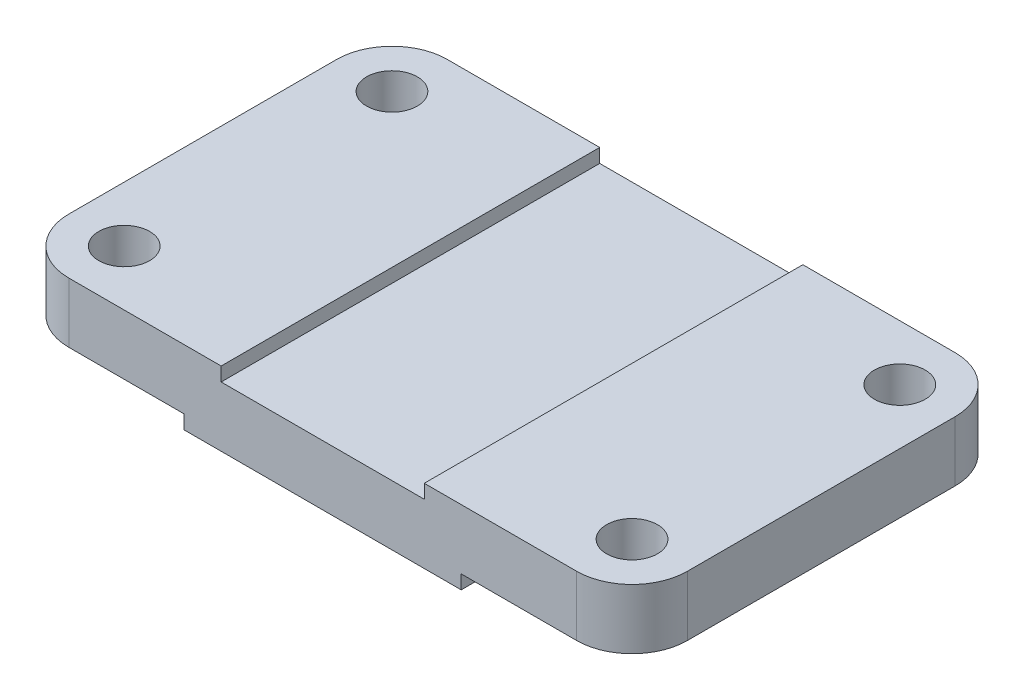
ISO-10303-21;
HEADER;
FILE_DESCRIPTION(('STEP AP214'),'2;1');
FILE_NAME('part.step','',(''),(''),'','','');
FILE_SCHEMA(('AUTOMOTIVE_DESIGN { 1 0 10303 214 1 1 1 1 }'));
ENDSEC;
DATA;
#1=APPLICATION_CONTEXT('core data for automotive mechanical design processes');
#2=APPLICATION_PROTOCOL_DEFINITION('international standard','automotive_design',2000,#1);
#3=PRODUCT_CONTEXT('',#1,'mechanical');
#4=PRODUCT('Part','Part','',(#3));
#5=PRODUCT_RELATED_PRODUCT_CATEGORY('part','',(#4));
#6=PRODUCT_DEFINITION_FORMATION('','',#4);
#7=PRODUCT_DEFINITION_CONTEXT('part definition',#1,'design');
#8=PRODUCT_DEFINITION('design','',#6,#7);
#9=PRODUCT_DEFINITION_SHAPE('','',#8);
#10=(LENGTH_UNIT() NAMED_UNIT(*) SI_UNIT(.MILLI.,.METRE.));
#11=(NAMED_UNIT(*) PLANE_ANGLE_UNIT() SI_UNIT($,.RADIAN.));
#12=(NAMED_UNIT(*) SI_UNIT($,.STERADIAN.) SOLID_ANGLE_UNIT());
#13=UNCERTAINTY_MEASURE_WITH_UNIT(LENGTH_MEASURE(1.E-05),#10,'distance_accuracy_value','');
#14=(GEOMETRIC_REPRESENTATION_CONTEXT(3) GLOBAL_UNCERTAINTY_ASSIGNED_CONTEXT((#13)) GLOBAL_UNIT_ASSIGNED_CONTEXT((#10,
#11,#12)) REPRESENTATION_CONTEXT('',''));
#15=CARTESIAN_POINT('',(0.,0.,0.));
#16=DIRECTION('',(0.,0.,1.));
#17=DIRECTION('',(1.,0.,0.));
#18=AXIS2_PLACEMENT_3D('',#15,#16,#17);
#19=CARTESIAN_POINT('',(-67.,16.,41.));
#20=DIRECTION('',(1.,0.,0.));
#21=DIRECTION('',(0.,0.,-1.));
#22=AXIS2_PLACEMENT_3D('',#19,#20,#21);
#23=PLANE('',#22);
#24=DIRECTION('',(0.,0.,-1.));
#25=VECTOR('',#24,1.);
#26=CARTESIAN_POINT('',(-67.,16.,41.));
#27=LINE('',#26,#25);
#28=CARTESIAN_POINT('',(-67.,16.,29.));
#29=VERTEX_POINT('',#28);
#30=CARTESIAN_POINT('',(-67.,16.,-29.));
#31=VERTEX_POINT('',#30);
#32=EDGE_CURVE('E192',#29,#31,#27,.T.);
#33=ORIENTED_EDGE('',*,*,#32,.T.);
#34=DIRECTION('',(0.,-1.,0.));
#35=VECTOR('',#34,1.);
#36=CARTESIAN_POINT('',(-67.,16.,-29.));
#37=LINE('',#36,#35);
#38=CARTESIAN_POINT('',(-67.,3.,-29.));
#39=VERTEX_POINT('',#38);
#40=EDGE_CURVE('E244',#31,#39,#37,.T.);
#41=ORIENTED_EDGE('',*,*,#40,.T.);
#42=DIRECTION('',(0.,0.,-1.));
#43=VECTOR('',#42,1.);
#44=CARTESIAN_POINT('',(-67.,3.,41.));
#45=LINE('',#44,#43);
#46=CARTESIAN_POINT('',(-67.,3.,29.));
#47=VERTEX_POINT('',#46);
#48=EDGE_CURVE('E167',#47,#39,#45,.T.);
#49=ORIENTED_EDGE('',*,*,#48,.F.);
#50=DIRECTION('',(0.,-1.,0.));
#51=VECTOR('',#50,1.);
#52=CARTESIAN_POINT('',(-67.,16.,29.));
#53=LINE('',#52,#51);
#54=EDGE_CURVE('E242',#47,#29,#53,.F.);
#55=ORIENTED_EDGE('',*,*,#54,.T.);
#56=EDGE_LOOP('',(#33,#41,#49,#55));
#57=FACE_BOUND('',#56,.T.);
#58=ADVANCED_FACE('F32',(#57),#23,.F.);
#59=CARTESIAN_POINT('',(-67.,3.,41.));
#60=DIRECTION('',(0.,1.,0.));
#61=DIRECTION('',(0.,0.,1.));
#62=AXIS2_PLACEMENT_3D('',#59,#60,#61);
#63=PLANE('',#62);
#64=CARTESIAN_POINT('',(-55.,3.,29.));
#65=DIRECTION('',(0.,1.,0.));
#66=DIRECTION('',(0.,0.,1.));
#67=AXIS2_PLACEMENT_3D('',#64,#65,#66);
#68=CIRCLE('',#67,5.5);
#69=CARTESIAN_POINT('',(-55.,3.,34.5));
#70=VERTEX_POINT('',#69);
#71=EDGE_CURVE('E517',#70,#70,#68,.T.);
#72=ORIENTED_EDGE('',*,*,#71,.T.);
#73=EDGE_LOOP('',(#72));
#74=FACE_BOUND('',#73,.T.);
#75=CARTESIAN_POINT('',(-55.,3.,-29.));
#76=DIRECTION('',(0.,1.,0.));
#77=DIRECTION('',(0.,0.,1.));
#78=AXIS2_PLACEMENT_3D('',#75,#76,#77);
#79=CIRCLE('',#78,5.5);
#80=CARTESIAN_POINT('',(-55.,3.,-23.5));
#81=VERTEX_POINT('',#80);
#82=EDGE_CURVE('E36',#81,#81,#79,.T.);
#83=ORIENTED_EDGE('',*,*,#82,.T.);
#84=EDGE_LOOP('',(#83));
#85=FACE_BOUND('',#84,.T.);
#86=ORIENTED_EDGE('',*,*,#48,.T.);
#87=CARTESIAN_POINT('',(-55.,3.,-29.));
#88=DIRECTION('',(0.,1.,0.));
#89=DIRECTION('',(0.,0.,1.));
#90=AXIS2_PLACEMENT_3D('',#87,#88,#89);
#91=CIRCLE('',#90,12.);
#92=CARTESIAN_POINT('',(-55.,3.,-41.));
#93=VERTEX_POINT('',#92);
#94=EDGE_CURVE('E249',#39,#93,#91,.F.);
#95=ORIENTED_EDGE('',*,*,#94,.T.);
#96=DIRECTION('',(1.,0.,0.));
#97=VECTOR('',#96,1.);
#98=CARTESIAN_POINT('',(-67.,3.,-41.));
#99=LINE('',#98,#97);
#100=CARTESIAN_POINT('',(-30.,3.,-41.));
#101=VERTEX_POINT('',#100);
#102=EDGE_CURVE('E164',#93,#101,#99,.T.);
#103=ORIENTED_EDGE('',*,*,#102,.T.);
#104=DIRECTION('',(0.,0.,-1.));
#105=VECTOR('',#104,1.);
#106=CARTESIAN_POINT('',(-30.,3.,41.));
#107=LINE('',#106,#105);
#108=CARTESIAN_POINT('',(-30.,3.,41.));
#109=VERTEX_POINT('',#108);
#110=EDGE_CURVE('E160',#109,#101,#107,.T.);
#111=ORIENTED_EDGE('',*,*,#110,.F.);
#112=DIRECTION('',(1.,0.,0.));
#113=VECTOR('',#112,1.);
#114=CARTESIAN_POINT('',(-67.,3.,41.));
#115=LINE('',#114,#113);
#116=CARTESIAN_POINT('',(-55.,3.,41.));
#117=VERTEX_POINT('',#116);
#118=EDGE_CURVE('E148',#117,#109,#115,.T.);
#119=ORIENTED_EDGE('',*,*,#118,.F.);
#120=CARTESIAN_POINT('',(-55.,3.,29.));
#121=DIRECTION('',(0.,1.,0.));
#122=DIRECTION('',(0.,0.,1.));
#123=AXIS2_PLACEMENT_3D('',#120,#121,#122);
#124=CIRCLE('',#123,12.);
#125=EDGE_CURVE('E247',#117,#47,#124,.F.);
#126=ORIENTED_EDGE('',*,*,#125,.T.);
#127=EDGE_LOOP('',(#86,#95,#103,#111,#119,#126));
#128=FACE_BOUND('',#127,.T.);
#129=ADVANCED_FACE('F162',(#74,#85,#128),#63,.F.);
#130=CARTESIAN_POINT('',(-30.,0.,41.));
#131=DIRECTION('',(1.,0.,0.));
#132=DIRECTION('',(0.,0.,-1.));
#133=AXIS2_PLACEMENT_3D('',#130,#131,#132);
#134=PLANE('',#133);
#135=DIRECTION('',(0.,-1.,0.));
#136=VECTOR('',#135,1.);
#137=CARTESIAN_POINT('',(-30.,0.,-41.));
#138=LINE('',#137,#136);
#139=CARTESIAN_POINT('',(-30.,0.,-41.));
#140=VERTEX_POINT('',#139);
#141=EDGE_CURVE('E194',#101,#140,#138,.T.);
#142=ORIENTED_EDGE('',*,*,#141,.T.);
#143=DIRECTION('',(0.,0.,-1.));
#144=VECTOR('',#143,1.);
#145=CARTESIAN_POINT('',(-30.,0.,41.));
#146=LINE('',#145,#144);
#147=CARTESIAN_POINT('',(-30.,0.,41.));
#148=VERTEX_POINT('',#147);
#149=EDGE_CURVE('E168',#148,#140,#146,.T.);
#150=ORIENTED_EDGE('',*,*,#149,.F.);
#151=DIRECTION('',(0.,-1.,0.));
#152=VECTOR('',#151,1.);
#153=CARTESIAN_POINT('',(-30.,0.,41.));
#154=LINE('',#153,#152);
#155=EDGE_CURVE('E152',#109,#148,#154,.T.);
#156=ORIENTED_EDGE('',*,*,#155,.F.);
#157=ORIENTED_EDGE('',*,*,#110,.T.);
#158=EDGE_LOOP('',(#142,#150,#156,#157));
#159=FACE_BOUND('',#158,.T.);
#160=ADVANCED_FACE('F170',(#159),#134,.F.);
#161=CARTESIAN_POINT('',(-30.,0.,41.));
#162=DIRECTION('',(0.,1.,0.));
#163=DIRECTION('',(-1.,0.,0.));
#164=AXIS2_PLACEMENT_3D('',#161,#162,#163);
#165=PLANE('',#164);
#166=DIRECTION('',(1.,0.,0.));
#167=VECTOR('',#166,1.);
#168=CARTESIAN_POINT('',(-30.,0.,-41.));
#169=LINE('',#168,#167);
#170=CARTESIAN_POINT('',(30.,0.,-41.));
#171=VERTEX_POINT('',#170);
#172=EDGE_CURVE('E197',#140,#171,#169,.T.);
#173=ORIENTED_EDGE('',*,*,#172,.T.);
#174=DIRECTION('',(0.,0.,-1.));
#175=VECTOR('',#174,1.);
#176=CARTESIAN_POINT('',(30.,0.,41.));
#177=LINE('',#176,#175);
#178=CARTESIAN_POINT('',(30.,0.,41.));
#179=VERTEX_POINT('',#178);
#180=EDGE_CURVE('E237',#179,#171,#177,.T.);
#181=ORIENTED_EDGE('',*,*,#180,.F.);
#182=DIRECTION('',(1.,0.,0.));
#183=VECTOR('',#182,1.);
#184=CARTESIAN_POINT('',(-30.,0.,41.));
#185=LINE('',#184,#183);
#186=EDGE_CURVE('E173',#148,#179,#185,.T.);
#187=ORIENTED_EDGE('',*,*,#186,.F.);
#188=ORIENTED_EDGE('',*,*,#149,.T.);
#189=EDGE_LOOP('',(#173,#181,#187,#188));
#190=FACE_BOUND('',#189,.T.);
#191=ADVANCED_FACE('F341',(#190),#165,.F.);
#192=CARTESIAN_POINT('',(30.,0.,41.));
#193=DIRECTION('',(-1.,0.,0.));
#194=DIRECTION('',(0.,0.,1.));
#195=AXIS2_PLACEMENT_3D('',#192,#193,#194);
#196=PLANE('',#195);
#197=DIRECTION('',(0.,1.,0.));
#198=VECTOR('',#197,1.);
#199=CARTESIAN_POINT('',(30.,0.,-41.));
#200=LINE('',#199,#198);
#201=CARTESIAN_POINT('',(30.,3.00000000000001,-41.));
#202=VERTEX_POINT('',#201);
#203=EDGE_CURVE('E199',#171,#202,#200,.T.);
#204=ORIENTED_EDGE('',*,*,#203,.T.);
#205=DIRECTION('',(0.,0.,-1.));
#206=VECTOR('',#205,1.);
#207=CARTESIAN_POINT('',(30.,3.00000000000001,41.));
#208=LINE('',#207,#206);
#209=CARTESIAN_POINT('',(30.,3.00000000000001,41.));
#210=VERTEX_POINT('',#209);
#211=EDGE_CURVE('E234',#210,#202,#208,.T.);
#212=ORIENTED_EDGE('',*,*,#211,.F.);
#213=DIRECTION('',(0.,1.,0.));
#214=VECTOR('',#213,1.);
#215=CARTESIAN_POINT('',(30.,0.,41.));
#216=LINE('',#215,#214);
#217=EDGE_CURVE('E175',#179,#210,#216,.T.);
#218=ORIENTED_EDGE('',*,*,#217,.F.);
#219=ORIENTED_EDGE('',*,*,#180,.T.);
#220=EDGE_LOOP('',(#204,#212,#218,#219));
#221=FACE_BOUND('',#220,.T.);
#222=ADVANCED_FACE('F346',(#221),#196,.F.);
#223=CARTESIAN_POINT('',(67.,3.00000000000002,41.));
#224=DIRECTION('',(0.,1.,0.));
#225=DIRECTION('',(-1.,0.,0.));
#226=AXIS2_PLACEMENT_3D('',#223,#224,#225);
#227=PLANE('',#226);
#228=CARTESIAN_POINT('',(55.,3.00000000000002,-29.));
#229=DIRECTION('',(0.,1.,0.));
#230=DIRECTION('',(-1.,0.,0.));
#231=AXIS2_PLACEMENT_3D('',#228,#229,#230);
#232=CIRCLE('',#231,5.5);
#233=CARTESIAN_POINT('',(49.5,3.00000000000002,-29.));
#234=VERTEX_POINT('',#233);
#235=EDGE_CURVE('E527',#234,#234,#232,.T.);
#236=ORIENTED_EDGE('',*,*,#235,.T.);
#237=EDGE_LOOP('',(#236));
#238=FACE_BOUND('',#237,.T.);
#239=CARTESIAN_POINT('',(55.,3.00000000000002,29.));
#240=DIRECTION('',(0.,1.,0.));
#241=DIRECTION('',(-1.,0.,0.));
#242=AXIS2_PLACEMENT_3D('',#239,#240,#241);
#243=CIRCLE('',#242,5.5);
#244=CARTESIAN_POINT('',(49.5,3.00000000000002,29.));
#245=VERTEX_POINT('',#244);
#246=EDGE_CURVE('E195',#245,#245,#243,.T.);
#247=ORIENTED_EDGE('',*,*,#246,.T.);
#248=EDGE_LOOP('',(#247));
#249=FACE_BOUND('',#248,.T.);
#250=DIRECTION('',(1.,0.,0.));
#251=VECTOR('',#250,1.);
#252=CARTESIAN_POINT('',(67.,3.00000000000002,-41.));
#253=LINE('',#252,#251);
#254=CARTESIAN_POINT('',(55.,3.00000000000002,-41.));
#255=VERTEX_POINT('',#254);
#256=EDGE_CURVE('E201',#202,#255,#253,.T.);
#257=ORIENTED_EDGE('',*,*,#256,.T.);
#258=CARTESIAN_POINT('',(55.,3.00000000000002,-29.));
#259=DIRECTION('',(0.,1.,0.));
#260=DIRECTION('',(-1.,0.,0.));
#261=AXIS2_PLACEMENT_3D('',#258,#259,#260);
#262=CIRCLE('',#261,12.);
#263=CARTESIAN_POINT('',(67.,3.00000000000002,-29.));
#264=VERTEX_POINT('',#263);
#265=EDGE_CURVE('E268',#255,#264,#262,.F.);
#266=ORIENTED_EDGE('',*,*,#265,.T.);
#267=DIRECTION('',(0.,0.,-1.));
#268=VECTOR('',#267,1.);
#269=CARTESIAN_POINT('',(67.,3.00000000000002,41.));
#270=LINE('',#269,#268);
#271=CARTESIAN_POINT('',(67.,3.00000000000002,29.));
#272=VERTEX_POINT('',#271);
#273=EDGE_CURVE('E231',#272,#264,#270,.T.);
#274=ORIENTED_EDGE('',*,*,#273,.F.);
#275=CARTESIAN_POINT('',(55.,3.00000000000002,29.));
#276=DIRECTION('',(0.,1.,0.));
#277=DIRECTION('',(-1.,0.,0.));
#278=AXIS2_PLACEMENT_3D('',#275,#276,#277);
#279=CIRCLE('',#278,12.);
#280=CARTESIAN_POINT('',(55.,3.00000000000002,41.));
#281=VERTEX_POINT('',#280);
#282=EDGE_CURVE('E48',#272,#281,#279,.F.);
#283=ORIENTED_EDGE('',*,*,#282,.T.);
#284=DIRECTION('',(1.,0.,0.));
#285=VECTOR('',#284,1.);
#286=CARTESIAN_POINT('',(67.,3.00000000000002,41.));
#287=LINE('',#286,#285);
#288=EDGE_CURVE('E180',#210,#281,#287,.T.);
#289=ORIENTED_EDGE('',*,*,#288,.F.);
#290=ORIENTED_EDGE('',*,*,#211,.T.);
#291=EDGE_LOOP('',(#257,#266,#274,#283,#289,#290));
#292=FACE_BOUND('',#291,.T.);
#293=ADVANCED_FACE('F271',(#238,#249,#292),#227,.F.);
#294=CARTESIAN_POINT('',(67.,16.,41.));
#295=DIRECTION('',(-1.,0.,0.));
#296=DIRECTION('',(0.,0.,1.));
#297=AXIS2_PLACEMENT_3D('',#294,#295,#296);
#298=PLANE('',#297);
#299=ORIENTED_EDGE('',*,*,#273,.T.);
#300=DIRECTION('',(0.,1.,0.));
#301=VECTOR('',#300,1.);
#302=CARTESIAN_POINT('',(67.,16.,-29.));
#303=LINE('',#302,#301);
#304=CARTESIAN_POINT('',(67.,16.,-29.));
#305=VERTEX_POINT('',#304);
#306=EDGE_CURVE('E261',#264,#305,#303,.T.);
#307=ORIENTED_EDGE('',*,*,#306,.T.);
#308=DIRECTION('',(0.,0.,-1.));
#309=VECTOR('',#308,1.);
#310=CARTESIAN_POINT('',(67.,16.,41.));
#311=LINE('',#310,#309);
#312=CARTESIAN_POINT('',(67.,16.,29.));
#313=VERTEX_POINT('',#312);
#314=EDGE_CURVE('E228',#313,#305,#311,.T.);
#315=ORIENTED_EDGE('',*,*,#314,.F.);
#316=DIRECTION('',(0.,1.,0.));
#317=VECTOR('',#316,1.);
#318=CARTESIAN_POINT('',(67.,3.00000000000002,29.));
#319=LINE('',#318,#317);
#320=EDGE_CURVE('E259',#313,#272,#319,.F.);
#321=ORIENTED_EDGE('',*,*,#320,.T.);
#322=EDGE_LOOP('',(#299,#307,#315,#321));
#323=FACE_BOUND('',#322,.T.);
#324=ADVANCED_FACE('F277',(#323),#298,.F.);
#325=CARTESIAN_POINT('',(22.,16.,41.));
#326=DIRECTION('',(0.,-1.,0.));
#327=DIRECTION('',(1.,0.,0.));
#328=AXIS2_PLACEMENT_3D('',#325,#326,#327);
#329=PLANE('',#328);
#330=CARTESIAN_POINT('',(55.,16.,-29.));
#331=DIRECTION('',(0.,1.,0.));
#332=DIRECTION('',(0.,0.,1.));
#333=AXIS2_PLACEMENT_3D('',#330,#331,#332);
#334=CIRCLE('',#333,5.5);
#335=CARTESIAN_POINT('',(55.,16.,-23.5));
#336=VERTEX_POINT('',#335);
#337=EDGE_CURVE('E524',#336,#336,#334,.T.);
#338=ORIENTED_EDGE('',*,*,#337,.F.);
#339=EDGE_LOOP('',(#338));
#340=FACE_BOUND('',#339,.T.);
#341=CARTESIAN_POINT('',(55.,16.,29.));
#342=DIRECTION('',(0.,1.,0.));
#343=DIRECTION('',(0.,0.,1.));
#344=AXIS2_PLACEMENT_3D('',#341,#342,#343);
#345=CIRCLE('',#344,5.5);
#346=CARTESIAN_POINT('',(55.,16.,34.5));
#347=VERTEX_POINT('',#346);
#348=EDGE_CURVE('E530',#347,#347,#345,.T.);
#349=ORIENTED_EDGE('',*,*,#348,.F.);
#350=EDGE_LOOP('',(#349));
#351=FACE_BOUND('',#350,.T.);
#352=ORIENTED_EDGE('',*,*,#314,.T.);
#353=CARTESIAN_POINT('',(55.,16.,-29.));
#354=DIRECTION('',(0.,-1.,0.));
#355=DIRECTION('',(1.,0.,0.));
#356=AXIS2_PLACEMENT_3D('',#353,#354,#355);
#357=CIRCLE('',#356,12.);
#358=CARTESIAN_POINT('',(55.,16.,-41.));
#359=VERTEX_POINT('',#358);
#360=EDGE_CURVE('E265',#305,#359,#357,.F.);
#361=ORIENTED_EDGE('',*,*,#360,.T.);
#362=DIRECTION('',(-1.,0.,0.));
#363=VECTOR('',#362,1.);
#364=CARTESIAN_POINT('',(22.,16.,-41.));
#365=LINE('',#364,#363);
#366=CARTESIAN_POINT('',(22.,16.,-41.));
#367=VERTEX_POINT('',#366);
#368=EDGE_CURVE('E204',#359,#367,#365,.T.);
#369=ORIENTED_EDGE('',*,*,#368,.T.);
#370=DIRECTION('',(0.,0.,-1.));
#371=VECTOR('',#370,1.);
#372=CARTESIAN_POINT('',(22.,16.,41.));
#373=LINE('',#372,#371);
#374=CARTESIAN_POINT('',(22.,16.,41.));
#375=VERTEX_POINT('',#374);
#376=EDGE_CURVE('E225',#375,#367,#373,.T.);
#377=ORIENTED_EDGE('',*,*,#376,.F.);
#378=DIRECTION('',(-1.,0.,0.));
#379=VECTOR('',#378,1.);
#380=CARTESIAN_POINT('',(22.,16.,41.));
#381=LINE('',#380,#379);
#382=CARTESIAN_POINT('',(55.,16.,41.));
#383=VERTEX_POINT('',#382);
#384=EDGE_CURVE('E182',#383,#375,#381,.T.);
#385=ORIENTED_EDGE('',*,*,#384,.F.);
#386=CARTESIAN_POINT('',(55.,16.,29.));
#387=DIRECTION('',(0.,-1.,0.));
#388=DIRECTION('',(1.,0.,0.));
#389=AXIS2_PLACEMENT_3D('',#386,#387,#388);
#390=CIRCLE('',#389,12.);
#391=EDGE_CURVE('E56',#383,#313,#390,.F.);
#392=ORIENTED_EDGE('',*,*,#391,.T.);
#393=EDGE_LOOP('',(#352,#361,#369,#377,#385,#392));
#394=FACE_BOUND('',#393,.T.);
#395=ADVANCED_FACE('F282',(#340,#351,#394),#329,.F.);
#396=CARTESIAN_POINT('',(22.,16.,41.));
#397=DIRECTION('',(1.,0.,0.));
#398=DIRECTION('',(0.,0.,-1.));
#399=AXIS2_PLACEMENT_3D('',#396,#397,#398);
#400=PLANE('',#399);
#401=DIRECTION('',(0.,-1.,0.));
#402=VECTOR('',#401,1.);
#403=CARTESIAN_POINT('',(22.,16.,-41.));
#404=LINE('',#403,#402);
#405=CARTESIAN_POINT('',(22.,13.,-41.));
#406=VERTEX_POINT('',#405);
#407=EDGE_CURVE('E206',#367,#406,#404,.T.);
#408=ORIENTED_EDGE('',*,*,#407,.T.);
#409=DIRECTION('',(0.,0.,-1.));
#410=VECTOR('',#409,1.);
#411=CARTESIAN_POINT('',(22.,13.,41.));
#412=LINE('',#411,#410);
#413=CARTESIAN_POINT('',(22.,13.,41.));
#414=VERTEX_POINT('',#413);
#415=EDGE_CURVE('E222',#414,#406,#412,.T.);
#416=ORIENTED_EDGE('',*,*,#415,.F.);
#417=DIRECTION('',(0.,-1.,0.));
#418=VECTOR('',#417,1.);
#419=CARTESIAN_POINT('',(22.,16.,41.));
#420=LINE('',#419,#418);
#421=EDGE_CURVE('E184',#375,#414,#420,.T.);
#422=ORIENTED_EDGE('',*,*,#421,.F.);
#423=ORIENTED_EDGE('',*,*,#376,.T.);
#424=EDGE_LOOP('',(#408,#416,#422,#423));
#425=FACE_BOUND('',#424,.T.);
#426=ADVANCED_FACE('F291',(#425),#400,.F.);
#427=CARTESIAN_POINT('',(-22.,13.,41.));
#428=DIRECTION('',(0.,-1.,0.));
#429=DIRECTION('',(1.,0.,0.));
#430=AXIS2_PLACEMENT_3D('',#427,#428,#429);
#431=PLANE('',#430);
#432=DIRECTION('',(-1.,0.,0.));
#433=VECTOR('',#432,1.);
#434=CARTESIAN_POINT('',(-22.,13.,-41.));
#435=LINE('',#434,#433);
#436=CARTESIAN_POINT('',(-22.,13.,-41.));
#437=VERTEX_POINT('',#436);
#438=EDGE_CURVE('E208',#406,#437,#435,.T.);
#439=ORIENTED_EDGE('',*,*,#438,.T.);
#440=DIRECTION('',(0.,0.,-1.));
#441=VECTOR('',#440,1.);
#442=CARTESIAN_POINT('',(-22.,13.,41.));
#443=LINE('',#442,#441);
#444=CARTESIAN_POINT('',(-22.,13.,41.));
#445=VERTEX_POINT('',#444);
#446=EDGE_CURVE('E219',#445,#437,#443,.T.);
#447=ORIENTED_EDGE('',*,*,#446,.F.);
#448=DIRECTION('',(-1.,0.,0.));
#449=VECTOR('',#448,1.);
#450=CARTESIAN_POINT('',(-22.,13.,41.));
#451=LINE('',#450,#449);
#452=EDGE_CURVE('E186',#414,#445,#451,.T.);
#453=ORIENTED_EDGE('',*,*,#452,.F.);
#454=ORIENTED_EDGE('',*,*,#415,.T.);
#455=EDGE_LOOP('',(#439,#447,#453,#454));
#456=FACE_BOUND('',#455,.T.);
#457=ADVANCED_FACE('F295',(#456),#431,.F.);
#458=CARTESIAN_POINT('',(-22.,16.,41.));
#459=DIRECTION('',(-1.,0.,0.));
#460=DIRECTION('',(0.,0.,1.));
#461=AXIS2_PLACEMENT_3D('',#458,#459,#460);
#462=PLANE('',#461);
#463=DIRECTION('',(0.,1.,0.));
#464=VECTOR('',#463,1.);
#465=CARTESIAN_POINT('',(-22.,16.,-41.));
#466=LINE('',#465,#464);
#467=CARTESIAN_POINT('',(-22.,16.,-41.));
#468=VERTEX_POINT('',#467);
#469=EDGE_CURVE('E210',#437,#468,#466,.T.);
#470=ORIENTED_EDGE('',*,*,#469,.T.);
#471=DIRECTION('',(0.,0.,-1.));
#472=VECTOR('',#471,1.);
#473=CARTESIAN_POINT('',(-22.,16.,41.));
#474=LINE('',#473,#472);
#475=CARTESIAN_POINT('',(-22.,16.,41.));
#476=VERTEX_POINT('',#475);
#477=EDGE_CURVE('E216',#476,#468,#474,.T.);
#478=ORIENTED_EDGE('',*,*,#477,.F.);
#479=DIRECTION('',(0.,1.,0.));
#480=VECTOR('',#479,1.);
#481=CARTESIAN_POINT('',(-22.,16.,41.));
#482=LINE('',#481,#480);
#483=EDGE_CURVE('E188',#445,#476,#482,.T.);
#484=ORIENTED_EDGE('',*,*,#483,.F.);
#485=ORIENTED_EDGE('',*,*,#446,.T.);
#486=EDGE_LOOP('',(#470,#478,#484,#485));
#487=FACE_BOUND('',#486,.T.);
#488=ADVANCED_FACE('F390',(#487),#462,.F.);
#489=CARTESIAN_POINT('',(-67.,16.,41.));
#490=DIRECTION('',(0.,-1.,0.));
#491=DIRECTION('',(0.,0.,-1.));
#492=AXIS2_PLACEMENT_3D('',#489,#490,#491);
#493=PLANE('',#492);
#494=CARTESIAN_POINT('',(-55.,16.,29.));
#495=DIRECTION('',(0.,1.,0.));
#496=DIRECTION('',(0.,0.,1.));
#497=AXIS2_PLACEMENT_3D('',#494,#495,#496);
#498=CIRCLE('',#497,5.5);
#499=CARTESIAN_POINT('',(-55.,16.,34.5));
#500=VERTEX_POINT('',#499);
#501=EDGE_CURVE('E514',#500,#500,#498,.T.);
#502=ORIENTED_EDGE('',*,*,#501,.F.);
#503=EDGE_LOOP('',(#502));
#504=FACE_BOUND('',#503,.T.);
#505=CARTESIAN_POINT('',(-55.,16.,-29.));
#506=DIRECTION('',(0.,1.,0.));
#507=DIRECTION('',(0.,0.,1.));
#508=AXIS2_PLACEMENT_3D('',#505,#506,#507);
#509=CIRCLE('',#508,5.5);
#510=CARTESIAN_POINT('',(-55.,16.,-23.5));
#511=VERTEX_POINT('',#510);
#512=EDGE_CURVE('E518',#511,#511,#509,.T.);
#513=ORIENTED_EDGE('',*,*,#512,.F.);
#514=EDGE_LOOP('',(#513));
#515=FACE_BOUND('',#514,.T.);
#516=DIRECTION('',(-1.,0.,0.));
#517=VECTOR('',#516,1.);
#518=CARTESIAN_POINT('',(-67.,16.,-41.));
#519=LINE('',#518,#517);
#520=CARTESIAN_POINT('',(-55.,16.,-41.));
#521=VERTEX_POINT('',#520);
#522=EDGE_CURVE('E157',#468,#521,#519,.T.);
#523=ORIENTED_EDGE('',*,*,#522,.T.);
#524=CARTESIAN_POINT('',(-55.,16.,-29.));
#525=DIRECTION('',(0.,-1.,0.));
#526=DIRECTION('',(0.,0.,-1.));
#527=AXIS2_PLACEMENT_3D('',#524,#525,#526);
#528=CIRCLE('',#527,12.);
#529=EDGE_CURVE('E257',#521,#31,#528,.F.);
#530=ORIENTED_EDGE('',*,*,#529,.T.);
#531=ORIENTED_EDGE('',*,*,#32,.F.);
#532=CARTESIAN_POINT('',(-55.,16.,29.));
#533=DIRECTION('',(0.,-1.,0.));
#534=DIRECTION('',(0.,0.,-1.));
#535=AXIS2_PLACEMENT_3D('',#532,#533,#534);
#536=CIRCLE('',#535,12.);
#537=CARTESIAN_POINT('',(-55.,16.,41.));
#538=VERTEX_POINT('',#537);
#539=EDGE_CURVE('E255',#29,#538,#536,.F.);
#540=ORIENTED_EDGE('',*,*,#539,.T.);
#541=DIRECTION('',(-1.,0.,0.));
#542=VECTOR('',#541,1.);
#543=CARTESIAN_POINT('',(-67.,16.,41.));
#544=LINE('',#543,#542);
#545=EDGE_CURVE('E190',#476,#538,#544,.T.);
#546=ORIENTED_EDGE('',*,*,#545,.F.);
#547=ORIENTED_EDGE('',*,*,#477,.T.);
#548=EDGE_LOOP('',(#523,#530,#531,#540,#546,#547));
#549=FACE_BOUND('',#548,.T.);
#550=ADVANCED_FACE('F331',(#504,#515,#549),#493,.F.);
#551=CARTESIAN_POINT('',(-67.,3.,41.));
#552=DIRECTION('',(0.,0.,1.));
#553=DIRECTION('',(1.,0.,0.));
#554=AXIS2_PLACEMENT_3D('',#551,#552,#553);
#555=PLANE('',#554);
#556=ORIENTED_EDGE('',*,*,#288,.T.);
#557=DIRECTION('',(0.,1.,0.));
#558=VECTOR('',#557,1.);
#559=CARTESIAN_POINT('',(55.,16.,41.));
#560=LINE('',#559,#558);
#561=EDGE_CURVE('E11',#281,#383,#560,.T.);
#562=ORIENTED_EDGE('',*,*,#561,.T.);
#563=ORIENTED_EDGE('',*,*,#384,.T.);
#564=ORIENTED_EDGE('',*,*,#421,.T.);
#565=ORIENTED_EDGE('',*,*,#452,.T.);
#566=ORIENTED_EDGE('',*,*,#483,.T.);
#567=ORIENTED_EDGE('',*,*,#545,.T.);
#568=DIRECTION('',(0.,-1.,0.));
#569=VECTOR('',#568,1.);
#570=CARTESIAN_POINT('',(-55.,3.,41.));
#571=LINE('',#570,#569);
#572=EDGE_CURVE('E41',#538,#117,#571,.T.);
#573=ORIENTED_EDGE('',*,*,#572,.T.);
#574=ORIENTED_EDGE('',*,*,#118,.T.);
#575=ORIENTED_EDGE('',*,*,#155,.T.);
#576=ORIENTED_EDGE('',*,*,#186,.T.);
#577=ORIENTED_EDGE('',*,*,#217,.T.);
#578=EDGE_LOOP('',(#556,#562,#563,#564,#565,#566,#567,#573,#574,#575,#576,#577));
#579=FACE_BOUND('',#578,.T.);
#580=ADVANCED_FACE('F150',(#579),#555,.T.);
#581=CARTESIAN_POINT('',(-67.,3.,-41.));
#582=DIRECTION('',(0.,0.,1.));
#583=DIRECTION('',(1.,0.,0.));
#584=AXIS2_PLACEMENT_3D('',#581,#582,#583);
#585=PLANE('',#584);
#586=ORIENTED_EDGE('',*,*,#102,.F.);
#587=DIRECTION('',(0.,-1.,0.));
#588=VECTOR('',#587,1.);
#589=CARTESIAN_POINT('',(-55.,3.,-41.));
#590=LINE('',#589,#588);
#591=EDGE_CURVE('E253',#93,#521,#590,.F.);
#592=ORIENTED_EDGE('',*,*,#591,.T.);
#593=ORIENTED_EDGE('',*,*,#522,.F.);
#594=ORIENTED_EDGE('',*,*,#469,.F.);
#595=ORIENTED_EDGE('',*,*,#438,.F.);
#596=ORIENTED_EDGE('',*,*,#407,.F.);
#597=ORIENTED_EDGE('',*,*,#368,.F.);
#598=DIRECTION('',(0.,1.,0.));
#599=VECTOR('',#598,1.);
#600=CARTESIAN_POINT('',(55.,3.,-41.));
#601=LINE('',#600,#599);
#602=EDGE_CURVE('E251',#359,#255,#601,.F.);
#603=ORIENTED_EDGE('',*,*,#602,.T.);
#604=ORIENTED_EDGE('',*,*,#256,.F.);
#605=ORIENTED_EDGE('',*,*,#203,.F.);
#606=ORIENTED_EDGE('',*,*,#172,.F.);
#607=ORIENTED_EDGE('',*,*,#141,.F.);
#608=EDGE_LOOP('',(#586,#592,#593,#594,#595,#596,#597,#603,#604,#605,#606,#607));
#609=FACE_BOUND('',#608,.T.);
#610=ADVANCED_FACE('F286',(#609),#585,.F.);
#611=CARTESIAN_POINT('',(-55.,16.,-29.));
#612=DIRECTION('',(0.,-1.,0.));
#613=DIRECTION('',(0.,0.,-1.));
#614=AXIS2_PLACEMENT_3D('',#611,#612,#613);
#615=CYLINDRICAL_SURFACE('',#614,12.);
#616=ORIENTED_EDGE('',*,*,#529,.F.);
#617=ORIENTED_EDGE('',*,*,#591,.F.);
#618=ORIENTED_EDGE('',*,*,#94,.F.);
#619=ORIENTED_EDGE('',*,*,#40,.F.);
#620=EDGE_LOOP('',(#616,#617,#618,#619));
#621=FACE_BOUND('',#620,.T.);
#622=ADVANCED_FACE('F308',(#621),#615,.T.);
#623=CARTESIAN_POINT('',(55.,16.,-29.));
#624=DIRECTION('',(0.,1.,0.));
#625=DIRECTION('',(0.,0.,1.));
#626=AXIS2_PLACEMENT_3D('',#623,#624,#625);
#627=CYLINDRICAL_SURFACE('',#626,12.);
#628=ORIENTED_EDGE('',*,*,#265,.F.);
#629=ORIENTED_EDGE('',*,*,#602,.F.);
#630=ORIENTED_EDGE('',*,*,#360,.F.);
#631=ORIENTED_EDGE('',*,*,#306,.F.);
#632=EDGE_LOOP('',(#628,#629,#630,#631));
#633=FACE_BOUND('',#632,.T.);
#634=ADVANCED_FACE('F279',(#633),#627,.T.);
#635=CARTESIAN_POINT('',(55.,3.,29.));
#636=DIRECTION('',(0.,-1.,0.));
#637=DIRECTION('',(0.,0.,-1.));
#638=AXIS2_PLACEMENT_3D('',#635,#636,#637);
#639=CYLINDRICAL_SURFACE('',#638,12.);
#640=ORIENTED_EDGE('',*,*,#282,.F.);
#641=ORIENTED_EDGE('',*,*,#320,.F.);
#642=ORIENTED_EDGE('',*,*,#391,.F.);
#643=ORIENTED_EDGE('',*,*,#561,.F.);
#644=EDGE_LOOP('',(#640,#641,#642,#643));
#645=FACE_BOUND('',#644,.T.);
#646=ADVANCED_FACE('F300',(#645),#639,.T.);
#647=CARTESIAN_POINT('',(-55.,3.,29.));
#648=DIRECTION('',(0.,1.,0.));
#649=DIRECTION('',(0.,0.,1.));
#650=AXIS2_PLACEMENT_3D('',#647,#648,#649);
#651=CYLINDRICAL_SURFACE('',#650,12.);
#652=ORIENTED_EDGE('',*,*,#539,.F.);
#653=ORIENTED_EDGE('',*,*,#54,.F.);
#654=ORIENTED_EDGE('',*,*,#125,.F.);
#655=ORIENTED_EDGE('',*,*,#572,.F.);
#656=EDGE_LOOP('',(#652,#653,#654,#655));
#657=FACE_BOUND('',#656,.T.);
#658=ADVANCED_FACE('F34',(#657),#651,.T.);
#659=CARTESIAN_POINT('',(55.,16.,29.));
#660=DIRECTION('',(0.,1.,0.));
#661=DIRECTION('',(0.,0.,1.));
#662=AXIS2_PLACEMENT_3D('',#659,#660,#661);
#663=CYLINDRICAL_SURFACE('',#662,5.5);
#664=ORIENTED_EDGE('',*,*,#348,.T.);
#665=EDGE_LOOP('',(#664));
#666=FACE_BOUND('',#665,.T.);
#667=ORIENTED_EDGE('',*,*,#246,.F.);
#668=EDGE_LOOP('',(#667));
#669=FACE_BOUND('',#668,.T.);
#670=ADVANCED_FACE('F306',(#666,#669),#663,.F.);
#671=CARTESIAN_POINT('',(55.,16.,-29.));
#672=DIRECTION('',(0.,1.,0.));
#673=DIRECTION('',(0.,0.,1.));
#674=AXIS2_PLACEMENT_3D('',#671,#672,#673);
#675=CYLINDRICAL_SURFACE('',#674,5.5);
#676=ORIENTED_EDGE('',*,*,#337,.T.);
#677=EDGE_LOOP('',(#676));
#678=FACE_BOUND('',#677,.T.);
#679=ORIENTED_EDGE('',*,*,#235,.F.);
#680=EDGE_LOOP('',(#679));
#681=FACE_BOUND('',#680,.T.);
#682=ADVANCED_FACE('F477',(#678,#681),#675,.F.);
#683=CARTESIAN_POINT('',(-55.,16.,-29.));
#684=DIRECTION('',(0.,1.,0.));
#685=DIRECTION('',(0.,0.,1.));
#686=AXIS2_PLACEMENT_3D('',#683,#684,#685);
#687=CYLINDRICAL_SURFACE('',#686,5.5);
#688=ORIENTED_EDGE('',*,*,#512,.T.);
#689=EDGE_LOOP('',(#688));
#690=FACE_BOUND('',#689,.T.);
#691=ORIENTED_EDGE('',*,*,#82,.F.);
#692=EDGE_LOOP('',(#691));
#693=FACE_BOUND('',#692,.T.);
#694=ADVANCED_FACE('F487',(#690,#693),#687,.F.);
#695=CARTESIAN_POINT('',(-55.,16.,29.));
#696=DIRECTION('',(0.,1.,0.));
#697=DIRECTION('',(0.,0.,1.));
#698=AXIS2_PLACEMENT_3D('',#695,#696,#697);
#699=CYLINDRICAL_SURFACE('',#698,5.5);
#700=ORIENTED_EDGE('',*,*,#501,.T.);
#701=EDGE_LOOP('',(#700));
#702=FACE_BOUND('',#701,.T.);
#703=ORIENTED_EDGE('',*,*,#71,.F.);
#704=EDGE_LOOP('',(#703));
#705=FACE_BOUND('',#704,.T.);
#706=ADVANCED_FACE('F497',(#702,#705),#699,.F.);
#707=CLOSED_SHELL('',(#58,#129,#160,#191,#222,#293,#324,#395,#426,#457,#488,#550,#580,#610,#622,
#634,#646,#658,#670,#682,#694,#706));
#708=MANIFOLD_SOLID_BREP('B2',#707);
#709=ADVANCED_BREP_SHAPE_REPRESENTATION('',(#18,#708),#14);
#710=SHAPE_DEFINITION_REPRESENTATION(#9,#709);
ENDSEC;
END-ISO-10303-21;
